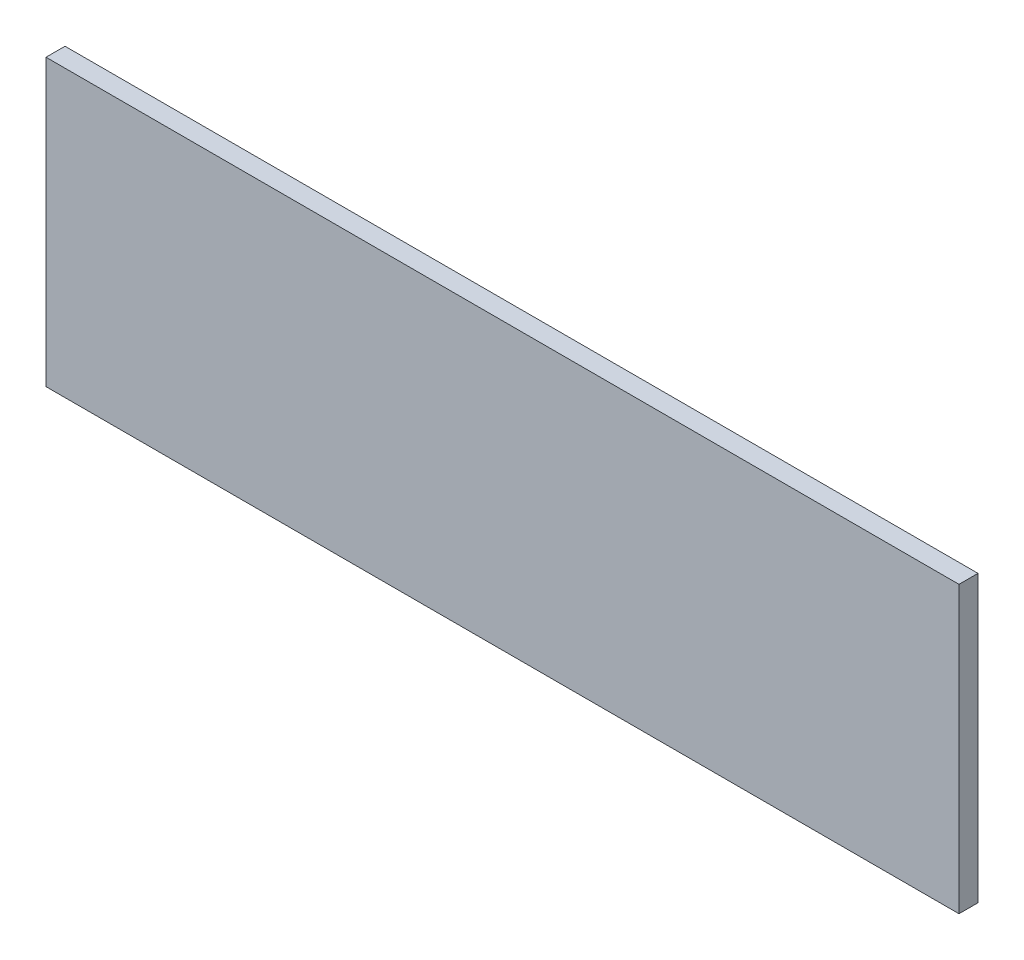
ISO-10303-21;
HEADER;
FILE_DESCRIPTION(('STEP AP214'),'2;1');
FILE_NAME('part.step','',(''),(''),'','','');
FILE_SCHEMA(('AUTOMOTIVE_DESIGN { 1 0 10303 214 1 1 1 1 }'));
ENDSEC;
DATA;
#1=APPLICATION_CONTEXT('core data for automotive mechanical design processes');
#2=APPLICATION_PROTOCOL_DEFINITION('international standard','automotive_design',2000,#1);
#3=PRODUCT_CONTEXT('',#1,'mechanical');
#4=PRODUCT('Part','Part','',(#3));
#5=PRODUCT_RELATED_PRODUCT_CATEGORY('part','',(#4));
#6=PRODUCT_DEFINITION_FORMATION('','',#4);
#7=PRODUCT_DEFINITION_CONTEXT('part definition',#1,'design');
#8=PRODUCT_DEFINITION('design','',#6,#7);
#9=PRODUCT_DEFINITION_SHAPE('','',#8);
#10=(LENGTH_UNIT() NAMED_UNIT(*) SI_UNIT(.MILLI.,.METRE.));
#11=(NAMED_UNIT(*) PLANE_ANGLE_UNIT() SI_UNIT($,.RADIAN.));
#12=(NAMED_UNIT(*) SI_UNIT($,.STERADIAN.) SOLID_ANGLE_UNIT());
#13=UNCERTAINTY_MEASURE_WITH_UNIT(LENGTH_MEASURE(1.E-05),#10,'distance_accuracy_value','');
#14=(GEOMETRIC_REPRESENTATION_CONTEXT(3) GLOBAL_UNCERTAINTY_ASSIGNED_CONTEXT((#13)) GLOBAL_UNIT_ASSIGNED_CONTEXT((#10,
#11,#12)) REPRESENTATION_CONTEXT('',''));
#15=CARTESIAN_POINT('',(0.,0.,0.));
#16=DIRECTION('',(0.,0.,1.));
#17=DIRECTION('',(1.,0.,0.));
#18=AXIS2_PLACEMENT_3D('',#15,#16,#17);
#19=CARTESIAN_POINT('',(-322.831858407079,-178.513274336283,20.));
#20=DIRECTION('',(-1.,0.,0.));
#21=DIRECTION('',(0.,0.,1.));
#22=AXIS2_PLACEMENT_3D('',#19,#20,#21);
#23=PLANE('',#22);
#24=DIRECTION('',(0.,1.,0.));
#25=VECTOR('',#24,1.);
#26=CARTESIAN_POINT('',(-322.831858407079,-178.513274336283,0.));
#27=LINE('',#26,#25);
#28=CARTESIAN_POINT('',(-322.831858407079,-178.513274336283,0.));
#29=VERTEX_POINT('',#28);
#30=CARTESIAN_POINT('',(-322.831858407079,121.486725663717,0.));
#31=VERTEX_POINT('',#30);
#32=EDGE_CURVE('E109',#29,#31,#27,.T.);
#33=ORIENTED_EDGE('',*,*,#32,.F.);
#34=DIRECTION('',(0.,0.,-1.));
#35=VECTOR('',#34,1.);
#36=CARTESIAN_POINT('',(-322.831858407079,-178.513274336283,20.));
#37=LINE('',#36,#35);
#38=CARTESIAN_POINT('',(-322.831858407079,-178.513274336283,20.));
#39=VERTEX_POINT('',#38);
#40=EDGE_CURVE('E11',#39,#29,#37,.T.);
#41=ORIENTED_EDGE('',*,*,#40,.F.);
#42=DIRECTION('',(0.,1.,0.));
#43=VECTOR('',#42,1.);
#44=CARTESIAN_POINT('',(-322.831858407079,-178.513274336283,20.));
#45=LINE('',#44,#43);
#46=CARTESIAN_POINT('',(-322.831858407079,121.486725663717,20.));
#47=VERTEX_POINT('',#46);
#48=EDGE_CURVE('E101',#39,#47,#45,.T.);
#49=ORIENTED_EDGE('',*,*,#48,.T.);
#50=DIRECTION('',(0.,0.,-1.));
#51=VECTOR('',#50,1.);
#52=CARTESIAN_POINT('',(-322.831858407079,121.486725663717,20.));
#53=LINE('',#52,#51);
#54=EDGE_CURVE('E42',#47,#31,#53,.T.);
#55=ORIENTED_EDGE('',*,*,#54,.T.);
#56=EDGE_LOOP('',(#33,#41,#49,#55));
#57=FACE_BOUND('',#56,.T.);
#58=ADVANCED_FACE('F39',(#57),#23,.T.);
#59=CARTESIAN_POINT('',(637.168141592921,-178.513274336283,20.));
#60=DIRECTION('',(0.,-1.,0.));
#61=DIRECTION('',(1.,0.,0.));
#62=AXIS2_PLACEMENT_3D('',#59,#60,#61);
#63=PLANE('',#62);
#64=DIRECTION('',(-1.,0.,0.));
#65=VECTOR('',#64,1.);
#66=CARTESIAN_POINT('',(637.168141592921,-178.513274336283,0.));
#67=LINE('',#66,#65);
#68=CARTESIAN_POINT('',(637.168141592921,-178.513274336283,0.));
#69=VERTEX_POINT('',#68);
#70=EDGE_CURVE('E104',#69,#29,#67,.T.);
#71=ORIENTED_EDGE('',*,*,#70,.F.);
#72=DIRECTION('',(0.,0.,-1.));
#73=VECTOR('',#72,1.);
#74=CARTESIAN_POINT('',(637.168141592921,-178.513274336283,20.));
#75=LINE('',#74,#73);
#76=CARTESIAN_POINT('',(637.168141592921,-178.513274336283,20.));
#77=VERTEX_POINT('',#76);
#78=EDGE_CURVE('E49',#77,#69,#75,.T.);
#79=ORIENTED_EDGE('',*,*,#78,.F.);
#80=DIRECTION('',(-1.,0.,0.));
#81=VECTOR('',#80,1.);
#82=CARTESIAN_POINT('',(637.168141592921,-178.513274336283,20.));
#83=LINE('',#82,#81);
#84=EDGE_CURVE('E96',#77,#39,#83,.T.);
#85=ORIENTED_EDGE('',*,*,#84,.T.);
#86=ORIENTED_EDGE('',*,*,#40,.T.);
#87=EDGE_LOOP('',(#71,#79,#85,#86));
#88=FACE_BOUND('',#87,.T.);
#89=ADVANCED_FACE('F125',(#88),#63,.T.);
#90=CARTESIAN_POINT('',(637.168141592921,121.486725663717,20.));
#91=DIRECTION('',(1.,0.,0.));
#92=DIRECTION('',(0.,0.,-1.));
#93=AXIS2_PLACEMENT_3D('',#90,#91,#92);
#94=PLANE('',#93);
#95=DIRECTION('',(0.,-1.,0.));
#96=VECTOR('',#95,1.);
#97=CARTESIAN_POINT('',(637.168141592921,121.486725663717,0.));
#98=LINE('',#97,#96);
#99=CARTESIAN_POINT('',(637.168141592921,121.486725663717,0.));
#100=VERTEX_POINT('',#99);
#101=EDGE_CURVE('E90',#100,#69,#98,.T.);
#102=ORIENTED_EDGE('',*,*,#101,.F.);
#103=DIRECTION('',(0.,0.,-1.));
#104=VECTOR('',#103,1.);
#105=CARTESIAN_POINT('',(637.168141592921,121.486725663717,20.));
#106=LINE('',#105,#104);
#107=CARTESIAN_POINT('',(637.168141592921,121.486725663717,20.));
#108=VERTEX_POINT('',#107);
#109=EDGE_CURVE('E85',#108,#100,#106,.T.);
#110=ORIENTED_EDGE('',*,*,#109,.F.);
#111=DIRECTION('',(0.,-1.,0.));
#112=VECTOR('',#111,1.);
#113=CARTESIAN_POINT('',(637.168141592921,121.486725663717,20.));
#114=LINE('',#113,#112);
#115=EDGE_CURVE('E88',#108,#77,#114,.T.);
#116=ORIENTED_EDGE('',*,*,#115,.T.);
#117=ORIENTED_EDGE('',*,*,#78,.T.);
#118=EDGE_LOOP('',(#102,#110,#116,#117));
#119=FACE_BOUND('',#118,.T.);
#120=ADVANCED_FACE('F87',(#119),#94,.T.);
#121=CARTESIAN_POINT('',(-322.831858407079,121.486725663717,20.));
#122=DIRECTION('',(0.,1.,0.));
#123=DIRECTION('',(0.,0.,1.));
#124=AXIS2_PLACEMENT_3D('',#121,#122,#123);
#125=PLANE('',#124);
#126=DIRECTION('',(1.,0.,0.));
#127=VECTOR('',#126,1.);
#128=CARTESIAN_POINT('',(-322.831858407079,121.486725663717,0.));
#129=LINE('',#128,#127);
#130=EDGE_CURVE('E113',#31,#100,#129,.T.);
#131=ORIENTED_EDGE('',*,*,#130,.F.);
#132=ORIENTED_EDGE('',*,*,#54,.F.);
#133=DIRECTION('',(1.,0.,0.));
#134=VECTOR('',#133,1.);
#135=CARTESIAN_POINT('',(-322.831858407079,121.486725663717,20.));
#136=LINE('',#135,#134);
#137=EDGE_CURVE('E95',#47,#108,#136,.T.);
#138=ORIENTED_EDGE('',*,*,#137,.T.);
#139=ORIENTED_EDGE('',*,*,#109,.T.);
#140=EDGE_LOOP('',(#131,#132,#138,#139));
#141=FACE_BOUND('',#140,.T.);
#142=ADVANCED_FACE('F99',(#141),#125,.T.);
#143=CARTESIAN_POINT('',(0.,0.,20.));
#144=DIRECTION('',(0.,0.,-1.));
#145=DIRECTION('',(-1.,0.,0.));
#146=AXIS2_PLACEMENT_3D('',#143,#144,#145);
#147=PLANE('',#146);
#148=ORIENTED_EDGE('',*,*,#48,.F.);
#149=ORIENTED_EDGE('',*,*,#84,.F.);
#150=ORIENTED_EDGE('',*,*,#115,.F.);
#151=ORIENTED_EDGE('',*,*,#137,.F.);
#152=EDGE_LOOP('',(#148,#149,#150,#151));
#153=FACE_BOUND('',#152,.T.);
#154=ADVANCED_FACE('F94',(#153),#147,.F.);
#155=CARTESIAN_POINT('',(0.,0.,0.));
#156=DIRECTION('',(0.,0.,-1.));
#157=DIRECTION('',(-1.,0.,0.));
#158=AXIS2_PLACEMENT_3D('',#155,#156,#157);
#159=PLANE('',#158);
#160=ORIENTED_EDGE('',*,*,#32,.T.);
#161=ORIENTED_EDGE('',*,*,#130,.T.);
#162=ORIENTED_EDGE('',*,*,#101,.T.);
#163=ORIENTED_EDGE('',*,*,#70,.T.);
#164=EDGE_LOOP('',(#160,#161,#162,#163));
#165=FACE_BOUND('',#164,.T.);
#166=ADVANCED_FACE('F124',(#165),#159,.T.);
#167=CLOSED_SHELL('',(#58,#89,#120,#142,#154,#166));
#168=MANIFOLD_SOLID_BREP('B2',#167);
#169=ADVANCED_BREP_SHAPE_REPRESENTATION('',(#18,#168),#14);
#170=SHAPE_DEFINITION_REPRESENTATION(#9,#169);
ENDSEC;
END-ISO-10303-21;
